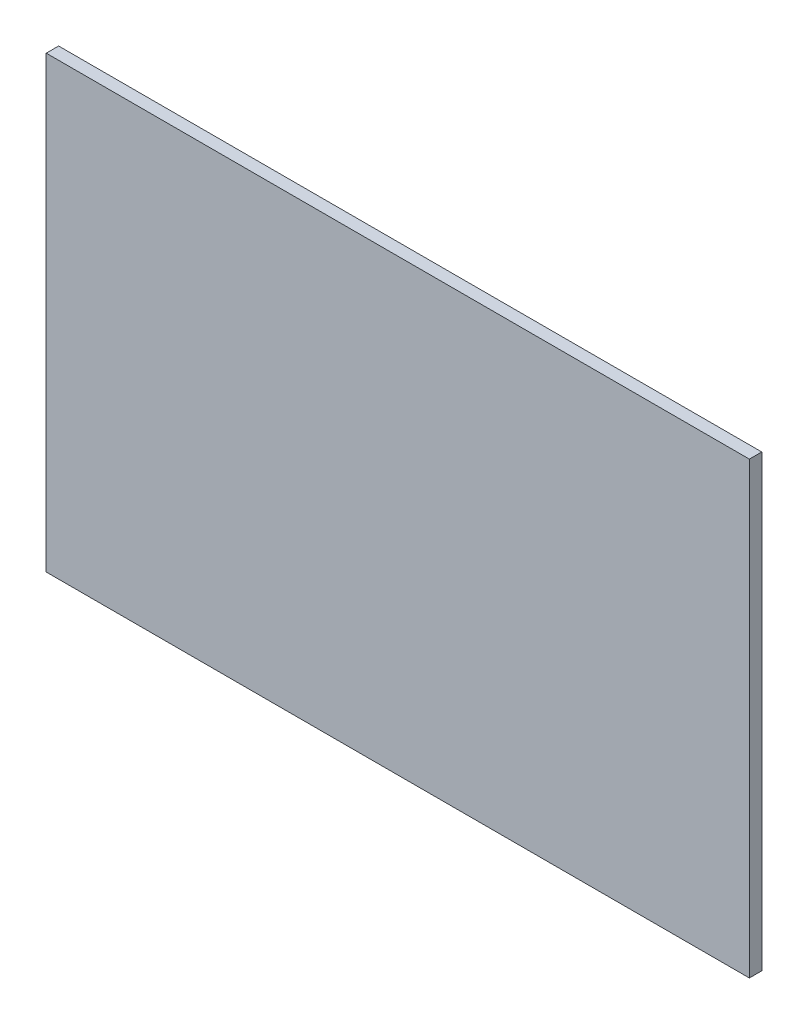
ISO-10303-21;
HEADER;
FILE_DESCRIPTION(('STEP AP214'),'2;1');
FILE_NAME('part.step','',(''),(''),'','','');
FILE_SCHEMA(('AUTOMOTIVE_DESIGN { 1 0 10303 214 1 1 1 1 }'));
ENDSEC;
DATA;
#1=APPLICATION_CONTEXT('core data for automotive mechanical design processes');
#2=APPLICATION_PROTOCOL_DEFINITION('international standard','automotive_design',2000,#1);
#3=PRODUCT_CONTEXT('',#1,'mechanical');
#4=PRODUCT('Part','Part','',(#3));
#5=PRODUCT_RELATED_PRODUCT_CATEGORY('part','',(#4));
#6=PRODUCT_DEFINITION_FORMATION('','',#4);
#7=PRODUCT_DEFINITION_CONTEXT('part definition',#1,'design');
#8=PRODUCT_DEFINITION('design','',#6,#7);
#9=PRODUCT_DEFINITION_SHAPE('','',#8);
#10=(LENGTH_UNIT() NAMED_UNIT(*) SI_UNIT(.MILLI.,.METRE.));
#11=(NAMED_UNIT(*) PLANE_ANGLE_UNIT() SI_UNIT($,.RADIAN.));
#12=(NAMED_UNIT(*) SI_UNIT($,.STERADIAN.) SOLID_ANGLE_UNIT());
#13=UNCERTAINTY_MEASURE_WITH_UNIT(LENGTH_MEASURE(1.E-05),#10,'distance_accuracy_value','');
#14=(GEOMETRIC_REPRESENTATION_CONTEXT(3) GLOBAL_UNCERTAINTY_ASSIGNED_CONTEXT((#13)) GLOBAL_UNIT_ASSIGNED_CONTEXT((#10,
#11,#12)) REPRESENTATION_CONTEXT('',''));
#15=CARTESIAN_POINT('',(0.,0.,0.));
#16=DIRECTION('',(0.,0.,1.));
#17=DIRECTION('',(1.,0.,0.));
#18=AXIS2_PLACEMENT_3D('',#15,#16,#17);
#19=CARTESIAN_POINT('',(-72.0108324084351,-46.0230521642619,2.54));
#20=DIRECTION('',(1.,0.,0.));
#21=DIRECTION('',(0.,0.,-1.));
#22=AXIS2_PLACEMENT_3D('',#19,#20,#21);
#23=PLANE('',#22);
#24=DIRECTION('',(0.,-1.,0.));
#25=VECTOR('',#24,1.);
#26=CARTESIAN_POINT('',(-72.0108324084351,-46.0230521642619,0.));
#27=LINE('',#26,#25);
#28=CARTESIAN_POINT('',(-72.0108324084351,46.0230521642619,0.));
#29=VERTEX_POINT('',#28);
#30=CARTESIAN_POINT('',(-72.0108324084351,-46.0230521642619,0.));
#31=VERTEX_POINT('',#30);
#32=EDGE_CURVE('E98',#29,#31,#27,.T.);
#33=ORIENTED_EDGE('',*,*,#32,.T.);
#34=DIRECTION('',(0.,0.,-1.));
#35=VECTOR('',#34,1.);
#36=CARTESIAN_POINT('',(-72.0108324084351,-46.0230521642619,2.54));
#37=LINE('',#36,#35);
#38=CARTESIAN_POINT('',(-72.0108324084351,-46.0230521642619,2.54));
#39=VERTEX_POINT('',#38);
#40=EDGE_CURVE('E11',#39,#31,#37,.T.);
#41=ORIENTED_EDGE('',*,*,#40,.F.);
#42=DIRECTION('',(0.,-1.,0.));
#43=VECTOR('',#42,1.);
#44=CARTESIAN_POINT('',(-72.0108324084351,-46.0230521642619,2.54));
#45=LINE('',#44,#43);
#46=CARTESIAN_POINT('',(-72.0108324084351,46.0230521642619,2.54));
#47=VERTEX_POINT('',#46);
#48=EDGE_CURVE('E86',#47,#39,#45,.T.);
#49=ORIENTED_EDGE('',*,*,#48,.F.);
#50=DIRECTION('',(0.,0.,-1.));
#51=VECTOR('',#50,1.);
#52=CARTESIAN_POINT('',(-72.0108324084351,46.0230521642619,2.54));
#53=LINE('',#52,#51);
#54=EDGE_CURVE('E94',#47,#29,#53,.T.);
#55=ORIENTED_EDGE('',*,*,#54,.T.);
#56=EDGE_LOOP('',(#33,#41,#49,#55));
#57=FACE_BOUND('',#56,.T.);
#58=ADVANCED_FACE('F35',(#57),#23,.F.);
#59=CARTESIAN_POINT('',(72.0108324084351,-46.0230521642619,2.54));
#60=DIRECTION('',(0.,1.,0.));
#61=DIRECTION('',(0.,0.,1.));
#62=AXIS2_PLACEMENT_3D('',#59,#60,#61);
#63=PLANE('',#62);
#64=DIRECTION('',(1.,0.,0.));
#65=VECTOR('',#64,1.);
#66=CARTESIAN_POINT('',(72.0108324084351,-46.0230521642619,0.));
#67=LINE('',#66,#65);
#68=CARTESIAN_POINT('',(72.0108324084351,-46.0230521642619,0.));
#69=VERTEX_POINT('',#68);
#70=EDGE_CURVE('E90',#31,#69,#67,.T.);
#71=ORIENTED_EDGE('',*,*,#70,.T.);
#72=DIRECTION('',(0.,0.,-1.));
#73=VECTOR('',#72,1.);
#74=CARTESIAN_POINT('',(72.0108324084351,-46.0230521642619,2.54));
#75=LINE('',#74,#73);
#76=CARTESIAN_POINT('',(72.0108324084351,-46.0230521642619,2.54));
#77=VERTEX_POINT('',#76);
#78=EDGE_CURVE('E43',#77,#69,#75,.T.);
#79=ORIENTED_EDGE('',*,*,#78,.F.);
#80=DIRECTION('',(1.,0.,0.));
#81=VECTOR('',#80,1.);
#82=CARTESIAN_POINT('',(72.0108324084351,-46.0230521642619,2.54));
#83=LINE('',#82,#81);
#84=EDGE_CURVE('E81',#39,#77,#83,.T.);
#85=ORIENTED_EDGE('',*,*,#84,.F.);
#86=ORIENTED_EDGE('',*,*,#40,.T.);
#87=EDGE_LOOP('',(#71,#79,#85,#86));
#88=FACE_BOUND('',#87,.T.);
#89=ADVANCED_FACE('F89',(#88),#63,.F.);
#90=CARTESIAN_POINT('',(72.0108324084351,-46.0230521642619,2.54));
#91=DIRECTION('',(-1.,0.,0.));
#92=DIRECTION('',(0.,0.,1.));
#93=AXIS2_PLACEMENT_3D('',#90,#91,#92);
#94=PLANE('',#93);
#95=DIRECTION('',(0.,1.,0.));
#96=VECTOR('',#95,1.);
#97=CARTESIAN_POINT('',(72.0108324084351,-46.0230521642619,0.));
#98=LINE('',#97,#96);
#99=CARTESIAN_POINT('',(72.0108324084351,46.0230521642619,0.));
#100=VERTEX_POINT('',#99);
#101=EDGE_CURVE('E68',#69,#100,#98,.T.);
#102=ORIENTED_EDGE('',*,*,#101,.T.);
#103=DIRECTION('',(0.,0.,-1.));
#104=VECTOR('',#103,1.);
#105=CARTESIAN_POINT('',(72.0108324084351,46.0230521642619,2.54));
#106=LINE('',#105,#104);
#107=CARTESIAN_POINT('',(72.0108324084351,46.0230521642619,2.54));
#108=VERTEX_POINT('',#107);
#109=EDGE_CURVE('E91',#108,#100,#106,.T.);
#110=ORIENTED_EDGE('',*,*,#109,.F.);
#111=DIRECTION('',(0.,1.,0.));
#112=VECTOR('',#111,1.);
#113=CARTESIAN_POINT('',(72.0108324084351,-46.0230521642619,2.54));
#114=LINE('',#113,#112);
#115=EDGE_CURVE('E84',#77,#108,#114,.T.);
#116=ORIENTED_EDGE('',*,*,#115,.F.);
#117=ORIENTED_EDGE('',*,*,#78,.T.);
#118=EDGE_LOOP('',(#102,#110,#116,#117));
#119=FACE_BOUND('',#118,.T.);
#120=ADVANCED_FACE('F92',(#119),#94,.F.);
#121=CARTESIAN_POINT('',(72.0108324084351,46.0230521642619,2.54));
#122=DIRECTION('',(0.,-1.,0.));
#123=DIRECTION('',(0.,0.,-1.));
#124=AXIS2_PLACEMENT_3D('',#121,#122,#123);
#125=PLANE('',#124);
#126=DIRECTION('',(-1.,0.,0.));
#127=VECTOR('',#126,1.);
#128=CARTESIAN_POINT('',(72.0108324084351,46.0230521642619,0.));
#129=LINE('',#128,#127);
#130=EDGE_CURVE('E74',#100,#29,#129,.T.);
#131=ORIENTED_EDGE('',*,*,#130,.T.);
#132=ORIENTED_EDGE('',*,*,#54,.F.);
#133=DIRECTION('',(-1.,0.,0.));
#134=VECTOR('',#133,1.);
#135=CARTESIAN_POINT('',(72.0108324084351,46.0230521642619,2.54));
#136=LINE('',#135,#134);
#137=EDGE_CURVE('E51',#108,#47,#136,.T.);
#138=ORIENTED_EDGE('',*,*,#137,.F.);
#139=ORIENTED_EDGE('',*,*,#109,.T.);
#140=EDGE_LOOP('',(#131,#132,#138,#139));
#141=FACE_BOUND('',#140,.T.);
#142=ADVANCED_FACE('F105',(#141),#125,.F.);
#143=CARTESIAN_POINT('',(0.,0.,2.54));
#144=DIRECTION('',(0.,0.,1.));
#145=DIRECTION('',(1.,0.,0.));
#146=AXIS2_PLACEMENT_3D('',#143,#144,#145);
#147=PLANE('',#146);
#148=ORIENTED_EDGE('',*,*,#48,.T.);
#149=ORIENTED_EDGE('',*,*,#84,.T.);
#150=ORIENTED_EDGE('',*,*,#115,.T.);
#151=ORIENTED_EDGE('',*,*,#137,.T.);
#152=EDGE_LOOP('',(#148,#149,#150,#151));
#153=FACE_BOUND('',#152,.T.);
#154=ADVANCED_FACE('F82',(#153),#147,.T.);
#155=CARTESIAN_POINT('',(0.,0.,0.));
#156=DIRECTION('',(0.,0.,1.));
#157=DIRECTION('',(1.,0.,0.));
#158=AXIS2_PLACEMENT_3D('',#155,#156,#157);
#159=PLANE('',#158);
#160=ORIENTED_EDGE('',*,*,#32,.F.);
#161=ORIENTED_EDGE('',*,*,#130,.F.);
#162=ORIENTED_EDGE('',*,*,#101,.F.);
#163=ORIENTED_EDGE('',*,*,#70,.F.);
#164=EDGE_LOOP('',(#160,#161,#162,#163));
#165=FACE_BOUND('',#164,.T.);
#166=ADVANCED_FACE('F108',(#165),#159,.F.);
#167=CLOSED_SHELL('',(#58,#89,#120,#142,#154,#166));
#168=MANIFOLD_SOLID_BREP('B2',#167);
#169=ADVANCED_BREP_SHAPE_REPRESENTATION('',(#18,#168),#14);
#170=SHAPE_DEFINITION_REPRESENTATION(#9,#169);
ENDSEC;
END-ISO-10303-21;
